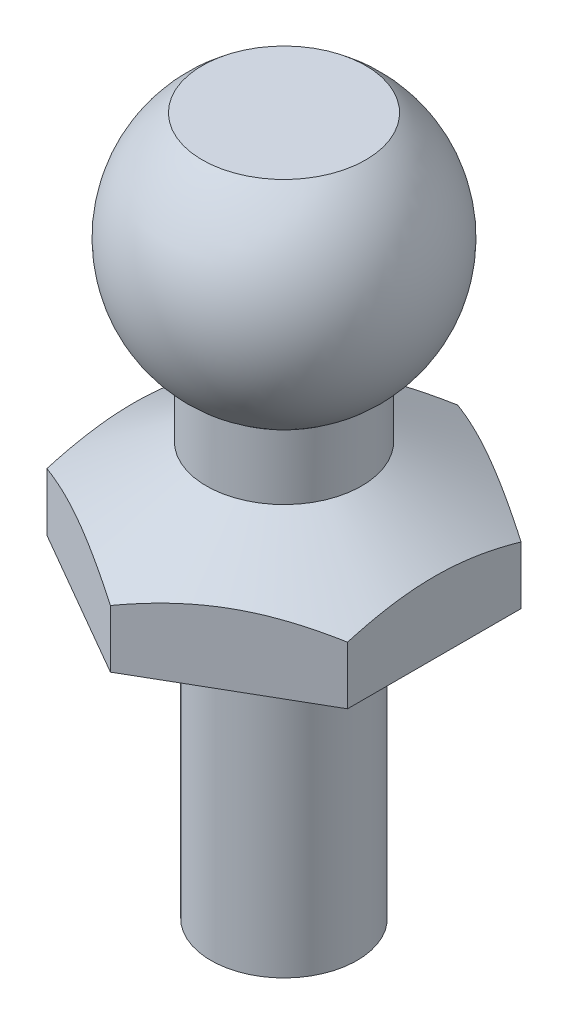
ISO-10303-21;
HEADER;
FILE_DESCRIPTION(('STEP AP214'),'2;1');
FILE_NAME('part.step','',(''),(''),'','','');
FILE_SCHEMA(('AUTOMOTIVE_DESIGN { 1 0 10303 214 1 1 1 1 }'));
ENDSEC;
DATA;
#1=APPLICATION_CONTEXT('core data for automotive mechanical design processes');
#2=APPLICATION_PROTOCOL_DEFINITION('international standard','automotive_design',2000,#1);
#3=PRODUCT_CONTEXT('',#1,'mechanical');
#4=PRODUCT('Part','Part','',(#3));
#5=PRODUCT_RELATED_PRODUCT_CATEGORY('part','',(#4));
#6=PRODUCT_DEFINITION_FORMATION('','',#4);
#7=PRODUCT_DEFINITION_CONTEXT('part definition',#1,'design');
#8=PRODUCT_DEFINITION('design','',#6,#7);
#9=PRODUCT_DEFINITION_SHAPE('','',#8);
#10=(LENGTH_UNIT() NAMED_UNIT(*) SI_UNIT(.MILLI.,.METRE.));
#11=(NAMED_UNIT(*) PLANE_ANGLE_UNIT() SI_UNIT($,.RADIAN.));
#12=(NAMED_UNIT(*) SI_UNIT($,.STERADIAN.) SOLID_ANGLE_UNIT());
#13=UNCERTAINTY_MEASURE_WITH_UNIT(LENGTH_MEASURE(1.E-05),#10,'distance_accuracy_value','');
#14=(GEOMETRIC_REPRESENTATION_CONTEXT(3) GLOBAL_UNCERTAINTY_ASSIGNED_CONTEXT((#13)) GLOBAL_UNIT_ASSIGNED_CONTEXT((#10,
#11,#12)) REPRESENTATION_CONTEXT('',''));
#15=CARTESIAN_POINT('',(0.,0.,0.));
#16=DIRECTION('',(0.,0.,1.));
#17=DIRECTION('',(1.,0.,0.));
#18=AXIS2_PLACEMENT_3D('',#15,#16,#17);
#19=CARTESIAN_POINT('',(0.,0.,0.));
#20=DIRECTION('',(0.,-1.,0.));
#21=DIRECTION('',(0.,0.,-1.));
#22=AXIS2_PLACEMENT_3D('',#19,#20,#21);
#23=CONICAL_SURFACE('',#22,4.23108891324555,1.0471975511966);
#24=CARTESIAN_POINT('',(0.,1.75,0.));
#25=DIRECTION('',(0.,-1.,0.));
#26=DIRECTION('',(0.,0.,-1.));
#27=AXIS2_PLACEMENT_3D('',#24,#25,#26);
#28=CIRCLE('',#27,1.2);
#29=CARTESIAN_POINT('',(0.,1.75,-1.2));
#30=VERTEX_POINT('',#29);
#31=EDGE_CURVE('E136',#30,#30,#28,.T.);
#32=ORIENTED_EDGE('',*,*,#31,.T.);
#33=EDGE_LOOP('',(#32));
#34=FACE_BOUND('',#33,.T.);
#35=CARTESIAN_POINT('',(-2.3252,0.892753652059998,1.34222390581204));
#36=CARTESIAN_POINT('',(-2.22302695541005,0.92682555650605,1.40121354060997));
#37=CARTESIAN_POINT('',(-2.11997196200676,0.957813006691565,1.4607123687927));
#38=CARTESIAN_POINT('',(-1.91207737180778,1.01190258974325,1.58074036640715));
#39=CARTESIAN_POINT('',(-1.80723408029191,1.03498558653344,1.64127166898656));
#40=CARTESIAN_POINT('',(-1.59884686897995,1.07091856136857,1.76158408153319));
#41=CARTESIAN_POINT('',(-1.49533501698976,1.08400767663292,1.82134667714405));
#42=CARTESIAN_POINT('',(-1.28782411294196,1.09963496627382,1.94115315345583));
#43=CARTESIAN_POINT('',(-1.18382581541717,1.10218607969364,2.00119659852703));
#44=CARTESIAN_POINT('',(-0.989489792170211,1.09688635692006,2.1133965538619));
#45=CARTESIAN_POINT('',(-0.899123014012503,1.09033678469002,2.16556983755705));
#46=CARTESIAN_POINT('',(-0.71897821261323,1.06957616139181,2.26957648713804));
#47=CARTESIAN_POINT('',(-0.629200812722479,1.05535801456797,2.32140949313211));
#48=CARTESIAN_POINT('',(-0.448684415608377,1.01981283326385,2.42563068359907));
#49=CARTESIAN_POINT('',(-0.357968272262398,0.998335084218501,2.47800567337972));
#50=CARTESIAN_POINT('',(-0.177889201764035,0.949588689040069,2.58197437320737));
#51=CARTESIAN_POINT('',(-0.088523966509104,0.92233150087227,2.633569415838));
#52=CARTESIAN_POINT('',(0.000200000000000463,0.892753652059998,2.6847942217856));
#53=B_SPLINE_CURVE_WITH_KNOTS('',3,(#35,#36,#37,#38,#39,#40,#41,#42,#43,#44,#45,#46,#47,#48,#49,
#50,#51,#52),.UNSPECIFIED.,.F.,.F.,(4,2,2,2,2,2,2,2,4),(0.,0.368546926418021,0.737979871298052,
1.0982689531844,1.45811552383217,1.77147298715322,2.08512089978438,2.40572717355966,
2.72570367853286),.UNSPECIFIED.);
#54=CARTESIAN_POINT('',(-2.325,0.892820323027555,1.34233937586588));
#55=VERTEX_POINT('',#54);
#56=CARTESIAN_POINT('',(0.,0.892820323027555,2.68467875173176));
#57=VERTEX_POINT('',#56);
#58=EDGE_CURVE('E139',#55,#57,#53,.T.);
#59=ORIENTED_EDGE('',*,*,#58,.T.);
#60=CARTESIAN_POINT('',(-0.000199999999999568,0.892753652059998,2.6847942217856));
#61=CARTESIAN_POINT('',(0.101973044589951,0.92682555650605,2.62580458698767));
#62=CARTESIAN_POINT('',(0.205028037993247,0.957813006691565,2.56630575880494));
#63=CARTESIAN_POINT('',(0.412922628192219,1.01190258974325,2.4462777611905));
#64=CARTESIAN_POINT('',(0.517765919708092,1.03498558653344,2.38574645861108));
#65=CARTESIAN_POINT('',(0.726153131020047,1.07091856136858,2.26543404606445));
#66=CARTESIAN_POINT('',(0.829664983010241,1.08400767663292,2.20567145045359));
#67=CARTESIAN_POINT('',(1.03717588705804,1.09963496627382,2.08586497414181));
#68=CARTESIAN_POINT('',(1.14117418458283,1.10218607969364,2.02582152907061));
#69=CARTESIAN_POINT('',(1.33551020782979,1.09688635692006,1.91362157373574));
#70=CARTESIAN_POINT('',(1.4258769859875,1.09033678469002,1.86144829004059));
#71=CARTESIAN_POINT('',(1.60602178738677,1.06957616139181,1.7574416404596));
#72=CARTESIAN_POINT('',(1.69579918727752,1.05535801456797,1.70560863446553));
#73=CARTESIAN_POINT('',(1.87631558439162,1.01981283326385,1.60138744399857));
#74=CARTESIAN_POINT('',(1.9670317277376,0.998335084218501,1.54901245421792));
#75=CARTESIAN_POINT('',(2.14711079823597,0.949588689040068,1.44504375439027));
#76=CARTESIAN_POINT('',(2.2364760334909,0.92233150087227,1.39344871175965));
#77=CARTESIAN_POINT('',(2.3252,0.892753652059998,1.34222390581204));
#78=B_SPLINE_CURVE_WITH_KNOTS('',3,(#60,#61,#62,#63,#64,#65,#66,#67,#68,#69,#70,#71,#72,#73,#74,
#75,#76,#77),.UNSPECIFIED.,.F.,.F.,(4,2,2,2,2,2,2,2,4),(0.,0.368546926418021,0.737979871298052,
1.0982689531844,1.45811552383217,1.77147298715322,2.08512089978438,2.40572717355966,
2.72570367853286),.UNSPECIFIED.);
#79=CARTESIAN_POINT('',(2.325,0.892820323027555,1.34233937586588));
#80=VERTEX_POINT('',#79);
#81=EDGE_CURVE('E12',#57,#80,#78,.T.);
#82=ORIENTED_EDGE('',*,*,#81,.T.);
#83=CARTESIAN_POINT('',(2.325,0.0373728394905505,-3.45729775810005));
#84=CARTESIAN_POINT('',(2.325,0.0852464898274882,-3.35734240601829));
#85=CARTESIAN_POINT('',(2.325,0.1326181909851,-3.25714205596067));
#86=CARTESIAN_POINT('',(2.325,0.226073716646254,-3.05612133660223));
#87=CARTESIAN_POINT('',(2.325,0.272157307597246,-2.95530085885499));
#88=CARTESIAN_POINT('',(2.325,0.36300992087353,-2.752331999043));
#89=CARTESIAN_POINT('',(2.325,0.407769272340542,-2.65017927168226));
#90=CARTESIAN_POINT('',(2.325,0.49526373241386,-2.44501364652332));
#91=CARTESIAN_POINT('',(2.325,0.537998946470295,-2.3420007938641));
#92=CARTESIAN_POINT('',(2.325,0.621969667488989,-2.13230362540511));
#93=CARTESIAN_POINT('',(2.325,0.663139095105434,-2.02559269216307));
#94=CARTESIAN_POINT('',(2.325,0.742031025984603,-1.81088032691761));
#95=CARTESIAN_POINT('',(2.325,0.779753133850881,-1.70287874848373));
#96=CARTESIAN_POINT('',(2.325,0.850670460106129,-1.48566546779842));
#97=CARTESIAN_POINT('',(2.325,0.883876140830638,-1.37645721860476));
#98=CARTESIAN_POINT('',(2.325,0.944626070336926,-1.15648301645577));
#99=CARTESIAN_POINT('',(2.325,0.97217171040626,-1.04571745347135));
#100=CARTESIAN_POINT('',(2.325,1.02024091542177,-0.822384555385061));
#101=CARTESIAN_POINT('',(2.325,1.04074870511363,-0.709813756993875));
#102=CARTESIAN_POINT('',(2.325,1.07323083925841,-0.483423769796037));
#103=CARTESIAN_POINT('',(2.325,1.08520574921256,-0.369604664226428));
#104=CARTESIAN_POINT('',(2.325,1.09951176841706,-0.142703158145371));
#105=CARTESIAN_POINT('',(2.325,1.101955625676,-0.0296280420039474));
#106=CARTESIAN_POINT('',(2.325,1.09728160796891,0.196331019021032));
#107=CARTESIAN_POINT('',(2.325,1.09016311267515,0.309214951026444));
#108=CARTESIAN_POINT('',(2.325,1.07000495901593,0.504971476046706));
#109=CARTESIAN_POINT('',(2.325,1.05897105625732,0.588060432816211));
#110=CARTESIAN_POINT('',(2.325,1.0324860444897,0.753537514794654));
#111=CARTESIAN_POINT('',(2.325,1.01703416338307,0.835925514908659));
#112=CARTESIAN_POINT('',(2.325,0.964869368104232,1.08199908338797));
#113=CARTESIAN_POINT('',(2.325,0.92236223721257,1.2444650461224));
#114=CARTESIAN_POINT('',(2.325,0.849809748583805,1.48740157094051));
#115=CARTESIAN_POINT('',(2.325,0.823821669828175,1.56915388131543));
#116=CARTESIAN_POINT('',(2.325,0.769460304214075,1.73181217055295));
#117=CARTESIAN_POINT('',(2.325,0.741088510017979,1.81271864389971));
#118=CARTESIAN_POINT('',(2.325,0.682369176748273,1.9737879977297));
#119=CARTESIAN_POINT('',(2.325,0.652022005063768,2.05395101333384));
#120=CARTESIAN_POINT('',(2.325,0.589678731478192,2.2136471626672));
#121=CARTESIAN_POINT('',(2.325,0.557682350675228,2.29318018721603));
#122=CARTESIAN_POINT('',(2.325,0.473034394688979,2.49846899151385));
#123=CARTESIAN_POINT('',(2.325,0.419340104533294,2.62379429359582));
#124=CARTESIAN_POINT('',(2.325,0.309355003184348,2.87330390677479));
#125=CARTESIAN_POINT('',(2.325,0.253063990616155,2.99748812848284));
#126=CARTESIAN_POINT('',(2.325,0.138483880115598,3.2449560739244));
#127=CARTESIAN_POINT('',(2.325,0.0801944226650155,3.36823963073852));
#128=CARTESIAN_POINT('',(2.325,-0.0379356344897946,3.61406252993989));
#129=CARTESIAN_POINT('',(2.325,-0.0977762691397784,3.73660185548379));
#130=CARTESIAN_POINT('',(2.325,-0.279264077264519,4.10361790031974));
#131=CARTESIAN_POINT('',(2.325,-0.402735624010783,4.34719157806593));
#132=CARTESIAN_POINT('',(2.325,-0.652796019952561,4.8326823081634));
#133=CARTESIAN_POINT('',(2.325,-0.779384459284665,5.07459957303802));
#134=CARTESIAN_POINT('',(2.325,-1.02246561690687,5.53413206496156));
#135=CARTESIAN_POINT('',(2.325,-1.13876142404804,5.75185161764551));
#136=CARTESIAN_POINT('',(2.325,-1.37265093526169,6.1866021973208));
#137=CARTESIAN_POINT('',(2.325,-1.49024468907339,6.40363319751261));
#138=CARTESIAN_POINT('',(2.325,-1.72610019251572,6.83660880991242));
#139=CARTESIAN_POINT('',(2.325,-1.84435945080083,7.05255478071697));
#140=CARTESIAN_POINT('',(2.325,-2.08162976672727,7.4840184940187));
#141=CARTESIAN_POINT('',(2.325,-2.20064078401521,7.69953625869861));
#142=CARTESIAN_POINT('',(2.325,-2.31992675086689,7.91490076183339));
#143=B_SPLINE_CURVE_WITH_KNOTS('',3,(#83,#84,#85,#86,#87,#88,#89,#90,#91,#92,#93,#94,#95,#96,
#97,#98,#99,#100,#101,#102,#103,#104,#105,#106,#107,#108,#109,#110,#111,#112,#113,#114,#115,
#116,#117,#118,#119,#120,#121,#122,#123,#124,#125,#126,#127,#128,#129,#130,#131,#132,#133,#134,
#135,#136,#137,#138,#139,#140,#141,#142),.UNSPECIFIED.,.F.,.F.,(4,2,2,2,2,2,2,2,2,2,2,2,2,2,2,2,
2,2,2,2,2,2,2,2,2,2,2,2,2,4),(0.,0.332490311478861,0.66504052214928,0.999608155761262,
1.33415834041331,1.67724394075196,2.02036884264289,2.36268483974656,2.70491659165468,
3.04791051664785,3.39088170822171,3.72978317578071,4.06870662957483,4.32003739482248,
4.57141211017735,5.0745499236141,5.33188271099448,5.5890555429144,5.84618068064838,
6.10334944504523,6.51233659469977,6.92135551466233,7.33044840684954,7.73955052332555,
8.55875268617683,9.37784769535118,10.1183406468909,10.858862074415,11.5974815834616,
12.3360617757641),.UNSPECIFIED.);
#144=CARTESIAN_POINT('',(2.325,0.892820323027554,-1.34233937586588));
#145=VERTEX_POINT('',#144);
#146=EDGE_CURVE('E48',#80,#145,#143,.F.);
#147=ORIENTED_EDGE('',*,*,#146,.T.);
#148=CARTESIAN_POINT('',(2.3252,0.892753652059998,-1.34222390581204));
#149=CARTESIAN_POINT('',(2.22302695541005,0.92682555650605,-1.40121354060997));
#150=CARTESIAN_POINT('',(2.11997196200676,0.957813006691565,-1.4607123687927));
#151=CARTESIAN_POINT('',(1.91207737180778,1.01190258974325,-1.58074036640715));
#152=CARTESIAN_POINT('',(1.80723408029191,1.03498558653344,-1.64127166898656));
#153=CARTESIAN_POINT('',(1.59884686897995,1.07091856136857,-1.76158408153319));
#154=CARTESIAN_POINT('',(1.49533501698976,1.08400767663292,-1.82134667714405));
#155=CARTESIAN_POINT('',(1.28782411294196,1.09963496627382,-1.94115315345583));
#156=CARTESIAN_POINT('',(1.18382581541717,1.10218607969364,-2.00119659852703));
#157=CARTESIAN_POINT('',(0.989489792170211,1.09688635692006,-2.1133965538619));
#158=CARTESIAN_POINT('',(0.899123014012503,1.09033678469002,-2.16556983755705));
#159=CARTESIAN_POINT('',(0.71897821261323,1.06957616139181,-2.26957648713804));
#160=CARTESIAN_POINT('',(0.629200812722479,1.05535801456797,-2.32140949313211));
#161=CARTESIAN_POINT('',(0.448684415608377,1.01981283326385,-2.42563068359907));
#162=CARTESIAN_POINT('',(0.357968272262398,0.998335084218501,-2.47800567337972));
#163=CARTESIAN_POINT('',(0.177889201764035,0.949588689040068,-2.58197437320737));
#164=CARTESIAN_POINT('',(0.088523966509104,0.92233150087227,-2.633569415838));
#165=CARTESIAN_POINT('',(-0.000200000000000347,0.892753652059998,-2.6847942217856));
#166=B_SPLINE_CURVE_WITH_KNOTS('',3,(#148,#149,#150,#151,#152,#153,#154,#155,#156,#157,#158,
#159,#160,#161,#162,#163,#164,#165),.UNSPECIFIED.,.F.,.F.,(4,2,2,2,2,2,2,2,4),(0.,
0.368546926418021,0.737979871298052,1.0982689531844,1.45811552383217,1.77147298715322,
2.08512089978438,2.40572717355966,2.72570367853286),.UNSPECIFIED.);
#167=CARTESIAN_POINT('',(0.,0.892820323027555,-2.68467875173176));
#168=VERTEX_POINT('',#167);
#169=EDGE_CURVE('E220',#145,#168,#166,.T.);
#170=ORIENTED_EDGE('',*,*,#169,.T.);
#171=CARTESIAN_POINT('',(0.000199999999999398,0.892753652059998,-2.6847942217856));
#172=CARTESIAN_POINT('',(-0.101973044589951,0.92682555650605,-2.62580458698767));
#173=CARTESIAN_POINT('',(-0.205028037993246,0.957813006691565,-2.56630575880494));
#174=CARTESIAN_POINT('',(-0.412922628192218,1.01190258974325,-2.4462777611905));
#175=CARTESIAN_POINT('',(-0.517765919708092,1.03498558653344,-2.38574645861108));
#176=CARTESIAN_POINT('',(-0.726153131020047,1.07091856136857,-2.26543404606445));
#177=CARTESIAN_POINT('',(-0.829664983010241,1.08400767663292,-2.20567145045359));
#178=CARTESIAN_POINT('',(-1.03717588705804,1.09963496627382,-2.08586497414181));
#179=CARTESIAN_POINT('',(-1.14117418458283,1.10218607969364,-2.02582152907061));
#180=CARTESIAN_POINT('',(-1.33551020782979,1.09688635692006,-1.91362157373574));
#181=CARTESIAN_POINT('',(-1.4258769859875,1.09033678469002,-1.86144829004059));
#182=CARTESIAN_POINT('',(-1.60602178738677,1.06957616139181,-1.75744164045961));
#183=CARTESIAN_POINT('',(-1.69579918727752,1.05535801456797,-1.70560863446554));
#184=CARTESIAN_POINT('',(-1.87631558439162,1.01981283326385,-1.60138744399857));
#185=CARTESIAN_POINT('',(-1.9670317277376,0.998335084218501,-1.54901245421792));
#186=CARTESIAN_POINT('',(-2.14711079823597,0.949588689040068,-1.44504375439027));
#187=CARTESIAN_POINT('',(-2.2364760334909,0.92233150087227,-1.39344871175965));
#188=CARTESIAN_POINT('',(-2.3252,0.892753652059998,-1.34222390581204));
#189=B_SPLINE_CURVE_WITH_KNOTS('',3,(#171,#172,#173,#174,#175,#176,#177,#178,#179,#180,#181,
#182,#183,#184,#185,#186,#187,#188),.UNSPECIFIED.,.F.,.F.,(4,2,2,2,2,2,2,2,4),(0.,
0.368546926418021,0.737979871298052,1.0982689531844,1.45811552383217,1.77147298715322,
2.08512089978438,2.40572717355966,2.72570367853286),.UNSPECIFIED.);
#190=CARTESIAN_POINT('',(-2.325,0.892820323027555,-1.34233937586588));
#191=VERTEX_POINT('',#190);
#192=EDGE_CURVE('E225',#168,#191,#189,.T.);
#193=ORIENTED_EDGE('',*,*,#192,.T.);
#194=CARTESIAN_POINT('',(-2.325,0.0373728394905505,-3.45729775810005));
#195=CARTESIAN_POINT('',(-2.325,0.0852464898274887,-3.35734240601829));
#196=CARTESIAN_POINT('',(-2.325,0.132618190985101,-3.25714205596067));
#197=CARTESIAN_POINT('',(-2.325,0.226073716646254,-3.05612133660223));
#198=CARTESIAN_POINT('',(-2.325,0.272157307597246,-2.95530085885499));
#199=CARTESIAN_POINT('',(-2.325,0.363009920873529,-2.752331999043));
#200=CARTESIAN_POINT('',(-2.325,0.407769272340542,-2.65017927168226));
#201=CARTESIAN_POINT('',(-2.325,0.49526373241386,-2.44501364652332));
#202=CARTESIAN_POINT('',(-2.325,0.537998946470295,-2.3420007938641));
#203=CARTESIAN_POINT('',(-2.325,0.621969667488989,-2.13230362540511));
#204=CARTESIAN_POINT('',(-2.325,0.663139095105434,-2.02559269216307));
#205=CARTESIAN_POINT('',(-2.325,0.742031025984603,-1.81088032691761));
#206=CARTESIAN_POINT('',(-2.325,0.779753133850881,-1.70287874848373));
#207=CARTESIAN_POINT('',(-2.325,0.850670460106129,-1.48566546779842));
#208=CARTESIAN_POINT('',(-2.325,0.883876140830638,-1.37645721860476));
#209=CARTESIAN_POINT('',(-2.325,0.944626070336926,-1.15648301645577));
#210=CARTESIAN_POINT('',(-2.325,0.97217171040626,-1.04571745347135));
#211=CARTESIAN_POINT('',(-2.325,1.02024091542177,-0.822384555385061));
#212=CARTESIAN_POINT('',(-2.325,1.04074870511363,-0.709813756993875));
#213=CARTESIAN_POINT('',(-2.325,1.07323083925841,-0.483423769796037));
#214=CARTESIAN_POINT('',(-2.325,1.08520574921256,-0.369604664226427));
#215=CARTESIAN_POINT('',(-2.325,1.09951176841706,-0.14270315814537));
#216=CARTESIAN_POINT('',(-2.325,1.101955625676,-0.0296280420039472));
#217=CARTESIAN_POINT('',(-2.325,1.09728160796891,0.196331019021032));
#218=CARTESIAN_POINT('',(-2.325,1.09016311267515,0.309214951026444));
#219=CARTESIAN_POINT('',(-2.325,1.07000495901593,0.504971476046707));
#220=CARTESIAN_POINT('',(-2.325,1.05897105625732,0.588060432816211));
#221=CARTESIAN_POINT('',(-2.325,1.0324860444897,0.753537514794655));
#222=CARTESIAN_POINT('',(-2.325,1.01703416338307,0.83592551490866));
#223=CARTESIAN_POINT('',(-2.325,0.964869368104232,1.08199908338797));
#224=CARTESIAN_POINT('',(-2.325,0.922362237212569,1.2444650461224));
#225=CARTESIAN_POINT('',(-2.325,0.849809748583804,1.48740157094051));
#226=CARTESIAN_POINT('',(-2.325,0.823821669828174,1.56915388131543));
#227=CARTESIAN_POINT('',(-2.325,0.769460304214074,1.73181217055296));
#228=CARTESIAN_POINT('',(-2.325,0.741088510017979,1.81271864389971));
#229=CARTESIAN_POINT('',(-2.325,0.682369176748272,1.97378799772971));
#230=CARTESIAN_POINT('',(-2.325,0.652022005063767,2.05395101333384));
#231=CARTESIAN_POINT('',(-2.325,0.589678731478192,2.2136471626672));
#232=CARTESIAN_POINT('',(-2.325,0.557682350675228,2.29318018721603));
#233=CARTESIAN_POINT('',(-2.325,0.473034394688979,2.49846899151385));
#234=CARTESIAN_POINT('',(-2.325,0.419340104533294,2.62379429359582));
#235=CARTESIAN_POINT('',(-2.325,0.309355003184347,2.87330390677479));
#236=CARTESIAN_POINT('',(-2.325,0.253063990616155,2.99748812848284));
#237=CARTESIAN_POINT('',(-2.325,0.138483880115598,3.2449560739244));
#238=CARTESIAN_POINT('',(-2.325,0.0801944226650152,3.36823963073852));
#239=CARTESIAN_POINT('',(-2.325,-0.037935634489795,3.61406252993989));
#240=CARTESIAN_POINT('',(-2.325,-0.0977762691397786,3.73660185548379));
#241=CARTESIAN_POINT('',(-2.325,-0.279264077264519,4.10361790031974));
#242=CARTESIAN_POINT('',(-2.325,-0.402735624010783,4.34719157806593));
#243=CARTESIAN_POINT('',(-2.325,-0.652796019952562,4.8326823081634));
#244=CARTESIAN_POINT('',(-2.325,-0.779384459284665,5.07459957303802));
#245=CARTESIAN_POINT('',(-2.325,-1.02246561690686,5.53413206496156));
#246=CARTESIAN_POINT('',(-2.325,-1.13876142404804,5.75185161764551));
#247=CARTESIAN_POINT('',(-2.325,-1.37265093526169,6.1866021973208));
#248=CARTESIAN_POINT('',(-2.325,-1.49024468907339,6.40363319751261));
#249=CARTESIAN_POINT('',(-2.325,-1.72610019251572,6.83660880991242));
#250=CARTESIAN_POINT('',(-2.325,-1.84435945080083,7.05255478071697));
#251=CARTESIAN_POINT('',(-2.325,-2.08162976672727,7.4840184940187));
#252=CARTESIAN_POINT('',(-2.325,-2.20064078401521,7.69953625869861));
#253=CARTESIAN_POINT('',(-2.325,-2.31992675086689,7.91490076183339));
#254=B_SPLINE_CURVE_WITH_KNOTS('',3,(#194,#195,#196,#197,#198,#199,#200,#201,#202,#203,#204,
#205,#206,#207,#208,#209,#210,#211,#212,#213,#214,#215,#216,#217,#218,#219,#220,#221,#222,#223,
#224,#225,#226,#227,#228,#229,#230,#231,#232,#233,#234,#235,#236,#237,#238,#239,#240,#241,#242,
#243,#244,#245,#246,#247,#248,#249,#250,#251,#252,#253),.UNSPECIFIED.,.F.,.F.,(4,2,2,2,2,2,2,2,
2,2,2,2,2,2,2,2,2,2,2,2,2,2,2,2,2,2,2,2,2,4),(0.,0.332490311478862,0.66504052214928,
0.999608155761262,1.33415834041331,1.67724394075196,2.02036884264289,2.36268483974656,
2.70491659165468,3.04791051664785,3.39088170822171,3.72978317578071,4.06870662957483,
4.32003739482248,4.57141211017735,5.0745499236141,5.33188271099449,5.5890555429144,
5.84618068064838,6.10334944504524,6.51233659469977,6.92135551466233,7.33044840684954,
7.73955052332555,8.55875268617683,9.37784769535118,10.1183406468909,10.858862074415,
11.5974815834616,12.3360617757641),.UNSPECIFIED.);
#255=EDGE_CURVE('E96',#191,#55,#254,.T.);
#256=ORIENTED_EDGE('',*,*,#255,.T.);
#257=EDGE_LOOP('',(#59,#82,#147,#170,#193,#256));
#258=FACE_BOUND('',#257,.T.);
#259=ADVANCED_FACE('F36',(#34,#258),#23,.T.);
#260=CARTESIAN_POINT('',(0.,0.,0.));
#261=DIRECTION('',(0.,-1.,0.));
#262=DIRECTION('',(0.,0.,-1.));
#263=AXIS2_PLACEMENT_3D('',#260,#261,#262);
#264=CYLINDRICAL_SURFACE('',#263,1.2);
#265=CARTESIAN_POINT('',(0.,2.75,0.));
#266=DIRECTION('',(0.,-1.,0.));
#267=DIRECTION('',(0.,0.,-1.));
#268=AXIS2_PLACEMENT_3D('',#265,#266,#267);
#269=CIRCLE('',#268,1.2);
#270=CARTESIAN_POINT('',(1.2,2.75,0.));
#271=VERTEX_POINT('',#270);
#272=EDGE_CURVE('E133',#271,#271,#269,.T.);
#273=ORIENTED_EDGE('',*,*,#272,.T.);
#274=EDGE_LOOP('',(#273));
#275=FACE_BOUND('',#274,.T.);
#276=ORIENTED_EDGE('',*,*,#31,.F.);
#277=EDGE_LOOP('',(#276));
#278=FACE_BOUND('',#277,.T.);
#279=ADVANCED_FACE('F170',(#275,#278),#264,.T.);
#280=CARTESIAN_POINT('',(0.,4.47336879396141,0.));
#281=DIRECTION('',(0.,-1.,0.));
#282=DIRECTION('',(1.,0.,0.));
#283=AXIS2_PLACEMENT_3D('',#280,#281,#282);
#284=SPHERICAL_SURFACE('',#283,2.1);
#285=CARTESIAN_POINT('',(0.,6.15,0.));
#286=DIRECTION('',(0.,-1.,0.));
#287=DIRECTION('',(0.,0.,-1.));
#288=AXIS2_PLACEMENT_3D('',#285,#286,#287);
#289=CIRCLE('',#288,1.26447925998712);
#290=CARTESIAN_POINT('',(1.26447925998712,6.15,0.));
#291=VERTEX_POINT('',#290);
#292=EDGE_CURVE('E125',#291,#291,#289,.T.);
#293=CARTESIAN_POINT('',(1.26447925998712,6.15,0.));
#294=CARTESIAN_POINT('',(1.29743961777583,6.12514390677472,0.));
#295=CARTESIAN_POINT('',(1.32966508695719,6.09931364871706,0.));
#296=CARTESIAN_POINT('',(1.39253852729641,6.04579969613998,0.));
#297=CARTESIAN_POINT('',(1.42318649845427,6.01811600162056,0.));
#298=CARTESIAN_POINT('',(1.48279722193764,5.96099006932295,0.));
#299=CARTESIAN_POINT('',(1.51175997426315,5.93154783154476,0.));
#300=CARTESIAN_POINT('',(1.5678998683815,5.87100754706463,0.));
#301=CARTESIAN_POINT('',(1.59507701017435,5.83990950036268,0.));
#302=CARTESIAN_POINT('',(1.64755110622248,5.77616562686699,0.));
#303=CARTESIAN_POINT('',(1.67284806047778,5.74351980007324,0.));
#304=CARTESIAN_POINT('',(1.72147384729716,5.6767939007677,0.));
#305=CARTESIAN_POINT('',(1.74480267986124,5.6427138282559,0.));
#306=CARTESIAN_POINT('',(1.78941110394798,5.57323792548134,0.));
#307=CARTESIAN_POINT('',(1.81069069547064,5.53784209521859,0.));
#308=CARTESIAN_POINT('',(1.85112665082552,5.46585774864491,0.));
#309=CARTESIAN_POINT('',(1.87028301465776,5.42926923233399,0.));
#310=CARTESIAN_POINT('',(1.90640590832679,5.35502672990128,0.));
#311=CARTESIAN_POINT('',(1.92337243816359,5.31737274377949,0.));
#312=CARTESIAN_POINT('',(1.95505667204188,5.24113022319538,0.));
#313=CARTESIAN_POINT('',(1.96977437608338,5.20254168873306,0.));
#314=CARTESIAN_POINT('',(1.99690978549872,5.1245642421525,0.));
#315=CARTESIAN_POINT('',(2.00932749087257,5.08517533003426,0.));
#316=CARTESIAN_POINT('',(2.03181972711851,5.00573408175197,0.));
#317=CARTESIAN_POINT('',(2.04189425799061,4.96568174558794,0.));
#318=CARTESIAN_POINT('',(2.05966511650826,4.88505290950957,0.));
#319=CARTESIAN_POINT('',(2.06736144415381,4.84447640959524,0.));
#320=CARTESIAN_POINT('',(2.08034913640954,4.76294032881053,0.));
#321=CARTESIAN_POINT('',(2.08564050101972,4.72198074794015,0.));
#322=CARTESIAN_POINT('',(2.09379986935106,4.63982091999317,0.));
#323=CARTESIAN_POINT('',(2.09666787307222,4.59862067291657,0.));
#324=CARTESIAN_POINT('',(2.09997054769654,4.51612276409352,0.));
#325=CARTESIAN_POINT('',(2.1004052185997,4.47482510234709,0.));
#326=CARTESIAN_POINT('',(2.09883971625546,4.39227595442745,0.));
#327=CARTESIAN_POINT('',(2.09683954300805,4.35102446825426,0.));
#328=CARTESIAN_POINT('',(2.09041130688144,4.26871110117363,0.));
#329=CARTESIAN_POINT('',(2.08598324400223,4.22764922026621,0.));
#330=CARTESIAN_POINT('',(2.07471462480144,4.14585783416014,0.));
#331=CARTESIAN_POINT('',(2.06787406847986,4.1051283289615,0.));
#332=CARTESIAN_POINT('',(2.05180424672278,4.02414330905932,0.));
#333=CARTESIAN_POINT('',(2.04257498128728,3.98388779435579,0.));
#334=CARTESIAN_POINT('',(2.02175983107181,3.90399072218594,0.));
#335=CARTESIAN_POINT('',(2.01017394629184,3.86434916471963,0.));
#336=CARTESIAN_POINT('',(1.98468584102645,3.78581783905928,0.));
#337=CARTESIAN_POINT('',(1.97078362054105,3.74692807086525,0.));
#338=CARTESIAN_POINT('',(1.94071118129624,3.67003554185735,0.));
#339=CARTESIAN_POINT('',(1.92454096253684,3.63203278104349,0.));
#340=CARTESIAN_POINT('',(1.88998874994795,3.5570464007689,0.));
#341=CARTESIAN_POINT('',(1.87160675611846,3.52006278130818,0.));
#342=CARTESIAN_POINT('',(1.83269490670355,3.44724327437764,0.));
#343=CARTESIAN_POINT('',(1.81216505111815,3.41140738690782,0.));
#344=CARTESIAN_POINT('',(1.76902886005041,3.34100794332146,0.));
#345=CARTESIAN_POINT('',(1.74642252456809,3.30644438720492,0.));
#346=CARTESIAN_POINT('',(1.69921197346124,3.23870978430485,0.));
#347=CARTESIAN_POINT('',(1.67460775783672,3.20553873752132,0.));
#348=CARTESIAN_POINT('',(1.62348699997883,3.14070448038844,0.));
#349=CARTESIAN_POINT('',(1.59697045774546,3.10904127003909,0.));
#350=CARTESIAN_POINT('',(1.5421172222893,3.04733280445863,0.));
#351=CARTESIAN_POINT('',(1.51378052906651,3.01728754922752,0.));
#352=CARTESIAN_POINT('',(1.45538559658118,2.95891935911861,0.));
#353=CARTESIAN_POINT('',(1.42532735731864,2.93059642424081,0.));
#354=CARTESIAN_POINT('',(1.36359354747525,2.87577172891743,0.));
#355=CARTESIAN_POINT('',(1.33191797689439,2.84926996847186,0.));
#356=CARTESIAN_POINT('',(1.26706074567514,2.79817836271235,0.));
#357=CARTESIAN_POINT('',(1.23387908503676,2.77358851739841,0.));
#358=CARTESIAN_POINT('',(1.2,2.75,0.));
#359=B_SPLINE_CURVE_WITH_KNOTS('',3,(#293,#294,#295,#296,#297,#298,#299,#300,#301,#302,#303,
#304,#305,#306,#307,#308,#309,#310,#311,#312,#313,#314,#315,#316,#317,#318,#319,#320,#321,#322,
#323,#324,#325,#326,#327,#328,#329,#330,#331,#332,#333,#334,#335,#336,#337,#338,#339,#340,#341,
#342,#343,#344,#345,#346,#347,#348,#349,#350,#351,#352,#353,#354,#355,#356,#357,#358),
.UNSPECIFIED.,.F.,.F.,(4,2,2,2,2,2,2,2,2,2,2,2,2,2,2,2,2,2,2,2,2,2,2,2,2,2,2,2,2,2,2,2,4),(0.,
0.123828048523355,0.24765609704671,0.371484145570065,0.495312194093421,0.619140242616776,
0.74296829114013,0.866796339663486,0.99062438818684,1.1144524367102,1.23828048523355,
1.36210853375691,1.48593658228026,1.60976463080362,1.73359267932697,1.85742072785033,
1.98124877637368,2.10507682489704,2.22890487342039,2.35273292194375,2.4765609704671,
2.60038901899046,2.72421706751381,2.84804511603717,2.97187316456052,3.09570121308388,
3.21952926160723,3.34335731013059,3.46718535865394,3.5910134071773,3.71484145570065,
3.83866950422401,3.96249755274737),.UNSPECIFIED.);
#360=EDGE_CURVE('BSEAM167',#291,#271,#359,.T.);
#361=ORIENTED_EDGE('',*,*,#292,.T.);
#362=ORIENTED_EDGE('',*,*,#272,.F.);
#363=ORIENTED_EDGE('',*,*,#360,.T.);
#364=ORIENTED_EDGE('',*,*,#360,.F.);
#365=EDGE_LOOP('',(#361,#363,#362,#364));
#366=FACE_BOUND('',#365,.T.);
#367=ADVANCED_FACE('F167',(#366),#284,.T.);
#368=CARTESIAN_POINT('',(1.26447925998712,6.15,0.));
#369=DIRECTION('',(0.,1.,0.));
#370=DIRECTION('',(0.,0.,1.));
#371=AXIS2_PLACEMENT_3D('',#368,#369,#370);
#372=PLANE('',#371);
#373=ORIENTED_EDGE('',*,*,#292,.F.);
#374=EDGE_LOOP('',(#373));
#375=FACE_BOUND('',#374,.T.);
#376=ADVANCED_FACE('F163',(#375),#372,.T.);
#377=CARTESIAN_POINT('',(2.325,6.15,1.34233937586588));
#378=DIRECTION('',(0.5,0.,0.866025403784439));
#379=DIRECTION('',(0.866025403784439,0.,-0.5));
#380=AXIS2_PLACEMENT_3D('',#377,#378,#379);
#381=PLANE('',#380);
#382=DIRECTION('',(0.,-1.,0.));
#383=VECTOR('',#382,1.);
#384=CARTESIAN_POINT('',(0.,6.15,2.68467875173176));
#385=LINE('',#384,#383);
#386=CARTESIAN_POINT('',(0.,0.,2.68467875173176));
#387=VERTEX_POINT('',#386);
#388=EDGE_CURVE('E63',#57,#387,#385,.T.);
#389=ORIENTED_EDGE('',*,*,#388,.T.);
#390=DIRECTION('',(-0.866025403784439,0.,0.5));
#391=VECTOR('',#390,1.);
#392=CARTESIAN_POINT('',(2.325,0.,1.34233937586588));
#393=LINE('',#392,#391);
#394=CARTESIAN_POINT('',(2.325,0.,1.34233937586588));
#395=VERTEX_POINT('',#394);
#396=EDGE_CURVE('E116',#395,#387,#393,.T.);
#397=ORIENTED_EDGE('',*,*,#396,.F.);
#398=DIRECTION('',(0.,-1.,0.));
#399=VECTOR('',#398,1.);
#400=CARTESIAN_POINT('',(2.325,6.15,1.34233937586588));
#401=LINE('',#400,#399);
#402=EDGE_CURVE('E123',#80,#395,#401,.T.);
#403=ORIENTED_EDGE('',*,*,#402,.F.);
#404=ORIENTED_EDGE('',*,*,#81,.F.);
#405=EDGE_LOOP('',(#389,#397,#403,#404));
#406=FACE_BOUND('',#405,.T.);
#407=ADVANCED_FACE('F158',(#406),#381,.T.);
#408=CARTESIAN_POINT('',(2.325,6.15,-1.34233937586588));
#409=DIRECTION('',(1.,0.,0.));
#410=DIRECTION('',(0.,0.,-1.));
#411=AXIS2_PLACEMENT_3D('',#408,#409,#410);
#412=PLANE('',#411);
#413=ORIENTED_EDGE('',*,*,#402,.T.);
#414=DIRECTION('',(0.,0.,1.));
#415=VECTOR('',#414,1.);
#416=CARTESIAN_POINT('',(2.325,0.,-1.34233937586588));
#417=LINE('',#416,#415);
#418=CARTESIAN_POINT('',(2.325,0.,-1.34233937586588));
#419=VERTEX_POINT('',#418);
#420=EDGE_CURVE('E121',#419,#395,#417,.T.);
#421=ORIENTED_EDGE('',*,*,#420,.F.);
#422=DIRECTION('',(0.,-1.,0.));
#423=VECTOR('',#422,1.);
#424=CARTESIAN_POINT('',(2.325,6.15,-1.34233937586588));
#425=LINE('',#424,#423);
#426=EDGE_CURVE('E126',#145,#419,#425,.T.);
#427=ORIENTED_EDGE('',*,*,#426,.F.);
#428=ORIENTED_EDGE('',*,*,#146,.F.);
#429=EDGE_LOOP('',(#413,#421,#427,#428));
#430=FACE_BOUND('',#429,.T.);
#431=ADVANCED_FACE('F162',(#430),#412,.T.);
#432=CARTESIAN_POINT('',(0.,6.15,-2.68467875173176));
#433=DIRECTION('',(0.5,0.,-0.866025403784439));
#434=DIRECTION('',(-0.866025403784439,0.,-0.5));
#435=AXIS2_PLACEMENT_3D('',#432,#433,#434);
#436=PLANE('',#435);
#437=ORIENTED_EDGE('',*,*,#426,.T.);
#438=DIRECTION('',(0.866025403784439,0.,0.5));
#439=VECTOR('',#438,1.);
#440=CARTESIAN_POINT('',(0.,0.,-2.68467875173176));
#441=LINE('',#440,#439);
#442=CARTESIAN_POINT('',(0.,0.,-2.68467875173176));
#443=VERTEX_POINT('',#442);
#444=EDGE_CURVE('E109',#443,#419,#441,.T.);
#445=ORIENTED_EDGE('',*,*,#444,.F.);
#446=DIRECTION('',(0.,-1.,0.));
#447=VECTOR('',#446,1.);
#448=CARTESIAN_POINT('',(0.,6.15,-2.68467875173176));
#449=LINE('',#448,#447);
#450=EDGE_CURVE('E99',#168,#443,#449,.T.);
#451=ORIENTED_EDGE('',*,*,#450,.F.);
#452=ORIENTED_EDGE('',*,*,#169,.F.);
#453=EDGE_LOOP('',(#437,#445,#451,#452));
#454=FACE_BOUND('',#453,.T.);
#455=ADVANCED_FACE('F213',(#454),#436,.T.);
#456=CARTESIAN_POINT('',(-2.325,6.15,-1.34233937586588));
#457=DIRECTION('',(-0.5,0.,-0.866025403784439));
#458=DIRECTION('',(-0.866025403784439,0.,0.5));
#459=AXIS2_PLACEMENT_3D('',#456,#457,#458);
#460=PLANE('',#459);
#461=ORIENTED_EDGE('',*,*,#450,.T.);
#462=DIRECTION('',(0.866025403784439,0.,-0.5));
#463=VECTOR('',#462,1.);
#464=CARTESIAN_POINT('',(-2.325,0.,-1.34233937586588));
#465=LINE('',#464,#463);
#466=CARTESIAN_POINT('',(-2.325,0.,-1.34233937586588));
#467=VERTEX_POINT('',#466);
#468=EDGE_CURVE('E103',#467,#443,#465,.T.);
#469=ORIENTED_EDGE('',*,*,#468,.F.);
#470=DIRECTION('',(0.,-1.,0.));
#471=VECTOR('',#470,1.);
#472=CARTESIAN_POINT('',(-2.325,6.15,-1.34233937586588));
#473=LINE('',#472,#471);
#474=EDGE_CURVE('E92',#191,#467,#473,.T.);
#475=ORIENTED_EDGE('',*,*,#474,.F.);
#476=ORIENTED_EDGE('',*,*,#192,.F.);
#477=EDGE_LOOP('',(#461,#469,#475,#476));
#478=FACE_BOUND('',#477,.T.);
#479=ADVANCED_FACE('F104',(#478),#460,.T.);
#480=CARTESIAN_POINT('',(-2.325,6.15,1.34233937586588));
#481=DIRECTION('',(-1.,0.,0.));
#482=DIRECTION('',(0.,0.,1.));
#483=AXIS2_PLACEMENT_3D('',#480,#481,#482);
#484=PLANE('',#483);
#485=ORIENTED_EDGE('',*,*,#474,.T.);
#486=DIRECTION('',(0.,0.,-1.));
#487=VECTOR('',#486,1.);
#488=CARTESIAN_POINT('',(-2.325,0.,1.34233937586588));
#489=LINE('',#488,#487);
#490=CARTESIAN_POINT('',(-2.325,0.,1.34233937586588));
#491=VERTEX_POINT('',#490);
#492=EDGE_CURVE('E55',#491,#467,#489,.T.);
#493=ORIENTED_EDGE('',*,*,#492,.F.);
#494=DIRECTION('',(0.,-1.,0.));
#495=VECTOR('',#494,1.);
#496=CARTESIAN_POINT('',(-2.325,6.15,1.34233937586588));
#497=LINE('',#496,#495);
#498=EDGE_CURVE('E100',#55,#491,#497,.T.);
#499=ORIENTED_EDGE('',*,*,#498,.F.);
#500=ORIENTED_EDGE('',*,*,#255,.F.);
#501=EDGE_LOOP('',(#485,#493,#499,#500));
#502=FACE_BOUND('',#501,.T.);
#503=ADVANCED_FACE('F94',(#502),#484,.T.);
#504=CARTESIAN_POINT('',(0.,6.15,2.68467875173176));
#505=DIRECTION('',(-0.5,0.,0.866025403784439));
#506=DIRECTION('',(0.866025403784439,0.,0.5));
#507=AXIS2_PLACEMENT_3D('',#504,#505,#506);
#508=PLANE('',#507);
#509=ORIENTED_EDGE('',*,*,#498,.T.);
#510=DIRECTION('',(-0.866025403784439,0.,-0.5));
#511=VECTOR('',#510,1.);
#512=CARTESIAN_POINT('',(0.,0.,2.68467875173176));
#513=LINE('',#512,#511);
#514=EDGE_CURVE('E114',#387,#491,#513,.T.);
#515=ORIENTED_EDGE('',*,*,#514,.F.);
#516=ORIENTED_EDGE('',*,*,#388,.F.);
#517=ORIENTED_EDGE('',*,*,#58,.F.);
#518=EDGE_LOOP('',(#509,#515,#516,#517));
#519=FACE_BOUND('',#518,.T.);
#520=ADVANCED_FACE('F153',(#519),#508,.T.);
#521=CARTESIAN_POINT('',(4.23108891324555,0.,0.));
#522=DIRECTION('',(0.,-1.,0.));
#523=DIRECTION('',(0.,0.,-1.));
#524=AXIS2_PLACEMENT_3D('',#521,#522,#523);
#525=PLANE('',#524);
#526=CARTESIAN_POINT('',(0.,0.,0.));
#527=DIRECTION('',(0.,-1.,0.));
#528=DIRECTION('',(0.,0.,-1.));
#529=AXIS2_PLACEMENT_3D('',#526,#527,#528);
#530=CIRCLE('',#529,1.1303);
#531=CARTESIAN_POINT('',(0.,0.,-1.1303));
#532=VERTEX_POINT('',#531);
#533=EDGE_CURVE('E188',#532,#532,#530,.T.);
#534=ORIENTED_EDGE('',*,*,#533,.F.);
#535=EDGE_LOOP('',(#534));
#536=FACE_BOUND('',#535,.T.);
#537=ORIENTED_EDGE('',*,*,#420,.T.);
#538=ORIENTED_EDGE('',*,*,#396,.T.);
#539=ORIENTED_EDGE('',*,*,#514,.T.);
#540=ORIENTED_EDGE('',*,*,#492,.T.);
#541=ORIENTED_EDGE('',*,*,#468,.T.);
#542=ORIENTED_EDGE('',*,*,#444,.T.);
#543=EDGE_LOOP('',(#537,#538,#539,#540,#541,#542));
#544=FACE_BOUND('',#543,.T.);
#545=ADVANCED_FACE('F38',(#536,#544),#525,.T.);
#546=CARTESIAN_POINT('',(0.,-4.64,0.));
#547=DIRECTION('',(0.,1.,0.));
#548=DIRECTION('',(0.,0.,1.));
#549=AXIS2_PLACEMENT_3D('',#546,#547,#548);
#550=CYLINDRICAL_SURFACE('',#549,1.1303);
#551=CARTESIAN_POINT('',(0.,-4.64,0.));
#552=DIRECTION('',(0.,-1.,0.));
#553=DIRECTION('',(0.,0.,-1.));
#554=AXIS2_PLACEMENT_3D('',#551,#552,#553);
#555=CIRCLE('',#554,1.1303);
#556=CARTESIAN_POINT('',(0.,-4.64,-1.1303));
#557=VERTEX_POINT('',#556);
#558=EDGE_CURVE('E186',#557,#557,#555,.T.);
#559=ORIENTED_EDGE('',*,*,#558,.F.);
#560=EDGE_LOOP('',(#559));
#561=FACE_BOUND('',#560,.T.);
#562=ORIENTED_EDGE('',*,*,#533,.T.);
#563=EDGE_LOOP('',(#562));
#564=FACE_BOUND('',#563,.T.);
#565=ADVANCED_FACE('F194',(#561,#564),#550,.T.);
#566=CARTESIAN_POINT('',(0.,-4.64,0.));
#567=DIRECTION('',(0.,-1.,0.));
#568=DIRECTION('',(0.,0.,-1.));
#569=AXIS2_PLACEMENT_3D('',#566,#567,#568);
#570=PLANE('',#569);
#571=ORIENTED_EDGE('',*,*,#558,.T.);
#572=EDGE_LOOP('',(#571));
#573=FACE_BOUND('',#572,.T.);
#574=ADVANCED_FACE('F200',(#573),#570,.T.);
#575=CLOSED_SHELL('',(#259,#279,#367,#376,#407,#431,#455,#479,#503,#520,#545,#565,#574));
#576=MANIFOLD_SOLID_BREP('B2',#575);
#577=ADVANCED_BREP_SHAPE_REPRESENTATION('',(#18,#576),#14);
#578=SHAPE_DEFINITION_REPRESENTATION(#9,#577);
ENDSEC;
END-ISO-10303-21;
